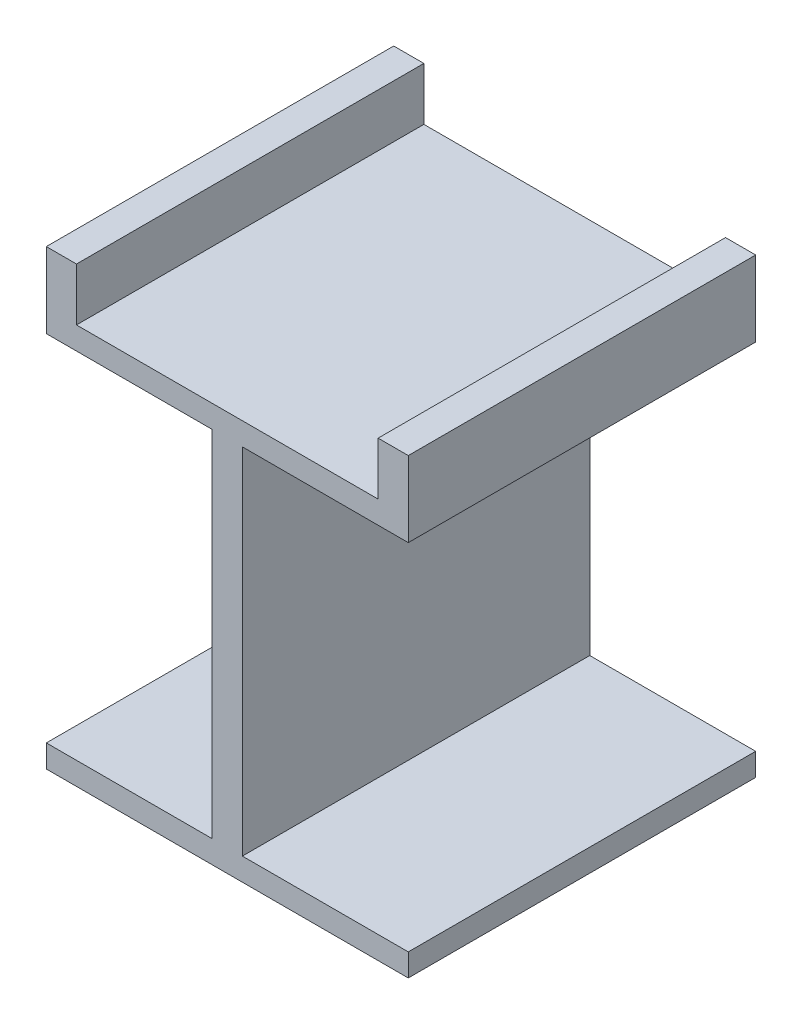
ISO-10303-21;
HEADER;
FILE_DESCRIPTION(('STEP AP214'),'2;1');
FILE_NAME('part.step','',(''),(''),'','','');
FILE_SCHEMA(('AUTOMOTIVE_DESIGN { 1 0 10303 214 1 1 1 1 }'));
ENDSEC;
DATA;
#1=APPLICATION_CONTEXT('core data for automotive mechanical design processes');
#2=APPLICATION_PROTOCOL_DEFINITION('international standard','automotive_design',2000,#1);
#3=PRODUCT_CONTEXT('',#1,'mechanical');
#4=PRODUCT('Part','Part','',(#3));
#5=PRODUCT_RELATED_PRODUCT_CATEGORY('part','',(#4));
#6=PRODUCT_DEFINITION_FORMATION('','',#4);
#7=PRODUCT_DEFINITION_CONTEXT('part definition',#1,'design');
#8=PRODUCT_DEFINITION('design','',#6,#7);
#9=PRODUCT_DEFINITION_SHAPE('','',#8);
#10=(LENGTH_UNIT() NAMED_UNIT(*) SI_UNIT(.MILLI.,.METRE.));
#11=(NAMED_UNIT(*) PLANE_ANGLE_UNIT() SI_UNIT($,.RADIAN.));
#12=(NAMED_UNIT(*) SI_UNIT($,.STERADIAN.) SOLID_ANGLE_UNIT());
#13=UNCERTAINTY_MEASURE_WITH_UNIT(LENGTH_MEASURE(1.E-05),#10,'distance_accuracy_value','');
#14=(GEOMETRIC_REPRESENTATION_CONTEXT(3) GLOBAL_UNCERTAINTY_ASSIGNED_CONTEXT((#13)) GLOBAL_UNIT_ASSIGNED_CONTEXT((#10,
#11,#12)) REPRESENTATION_CONTEXT('',''));
#15=CARTESIAN_POINT('',(0.,0.,0.));
#16=DIRECTION('',(0.,0.,1.));
#17=DIRECTION('',(1.,0.,0.));
#18=AXIS2_PLACEMENT_3D('',#15,#16,#17);
#19=CARTESIAN_POINT('',(0.,3.,0.));
#20=DIRECTION('',(0.,1.,0.));
#21=DIRECTION('',(0.,0.,1.));
#22=AXIS2_PLACEMENT_3D('',#19,#20,#21);
#23=PLANE('',#22);
#24=DIRECTION('',(0.,0.,-1.));
#25=VECTOR('',#24,1.);
#26=CARTESIAN_POINT('',(2.,3.,-23.035));
#27=LINE('',#26,#25);
#28=CARTESIAN_POINT('',(2.,3.,23.035));
#29=VERTEX_POINT('',#28);
#30=CARTESIAN_POINT('',(2.,3.,-23.035));
#31=VERTEX_POINT('',#30);
#32=EDGE_CURVE('E218',#29,#31,#27,.T.);
#33=ORIENTED_EDGE('',*,*,#32,.F.);
#34=DIRECTION('',(1.,0.,0.));
#35=VECTOR('',#34,1.);
#36=CARTESIAN_POINT('',(-24.,3.,23.035));
#37=LINE('',#36,#35);
#38=CARTESIAN_POINT('',(24.,3.,23.035));
#39=VERTEX_POINT('',#38);
#40=EDGE_CURVE('E246',#29,#39,#37,.T.);
#41=ORIENTED_EDGE('',*,*,#40,.T.);
#42=DIRECTION('',(0.,0.,-1.));
#43=VECTOR('',#42,1.);
#44=CARTESIAN_POINT('',(24.,3.,-23.035));
#45=LINE('',#44,#43);
#46=CARTESIAN_POINT('',(24.,3.,-23.035));
#47=VERTEX_POINT('',#46);
#48=EDGE_CURVE('E236',#39,#47,#45,.T.);
#49=ORIENTED_EDGE('',*,*,#48,.T.);
#50=DIRECTION('',(-1.,0.,0.));
#51=VECTOR('',#50,1.);
#52=CARTESIAN_POINT('',(-24.,3.,-23.035));
#53=LINE('',#52,#51);
#54=EDGE_CURVE('E241',#47,#31,#53,.T.);
#55=ORIENTED_EDGE('',*,*,#54,.T.);
#56=EDGE_LOOP('',(#33,#41,#49,#55));
#57=FACE_BOUND('',#56,.T.);
#58=ADVANCED_FACE('F32',(#57),#23,.T.);
#59=CARTESIAN_POINT('',(24.,3.,-23.035));
#60=DIRECTION('',(-1.,0.,0.));
#61=DIRECTION('',(0.,0.,1.));
#62=AXIS2_PLACEMENT_3D('',#59,#60,#61);
#63=PLANE('',#62);
#64=DIRECTION('',(0.,0.,-1.));
#65=VECTOR('',#64,1.);
#66=CARTESIAN_POINT('',(24.,0.,-23.035));
#67=LINE('',#66,#65);
#68=CARTESIAN_POINT('',(24.,0.,23.035));
#69=VERTEX_POINT('',#68);
#70=CARTESIAN_POINT('',(24.,0.,-23.035));
#71=VERTEX_POINT('',#70);
#72=EDGE_CURVE('E235',#69,#71,#67,.T.);
#73=ORIENTED_EDGE('',*,*,#72,.T.);
#74=DIRECTION('',(0.,-1.,0.));
#75=VECTOR('',#74,1.);
#76=CARTESIAN_POINT('',(24.,3.,-23.035));
#77=LINE('',#76,#75);
#78=EDGE_CURVE('E40',#47,#71,#77,.T.);
#79=ORIENTED_EDGE('',*,*,#78,.F.);
#80=ORIENTED_EDGE('',*,*,#48,.F.);
#81=DIRECTION('',(0.,-1.,0.));
#82=VECTOR('',#81,1.);
#83=CARTESIAN_POINT('',(24.,3.,23.035));
#84=LINE('',#83,#82);
#85=EDGE_CURVE('E250',#39,#69,#84,.T.);
#86=ORIENTED_EDGE('',*,*,#85,.T.);
#87=EDGE_LOOP('',(#73,#79,#80,#86));
#88=FACE_BOUND('',#87,.T.);
#89=ADVANCED_FACE('F34',(#88),#63,.F.);
#90=CARTESIAN_POINT('',(-24.,3.,-23.035));
#91=DIRECTION('',(0.,0.,1.));
#92=DIRECTION('',(1.,0.,0.));
#93=AXIS2_PLACEMENT_3D('',#90,#91,#92);
#94=PLANE('',#93);
#95=DIRECTION('',(0.,-1.,0.));
#96=VECTOR('',#95,1.);
#97=CARTESIAN_POINT('',(-2.,53.,-23.035));
#98=LINE('',#97,#96);
#99=CARTESIAN_POINT('',(-2.,50.,-23.035));
#100=VERTEX_POINT('',#99);
#101=CARTESIAN_POINT('',(-2.,3.,-23.035));
#102=VERTEX_POINT('',#101);
#103=EDGE_CURVE('E231',#100,#102,#98,.T.);
#104=ORIENTED_EDGE('',*,*,#103,.F.);
#105=DIRECTION('',(-1.,0.,0.));
#106=VECTOR('',#105,1.);
#107=CARTESIAN_POINT('',(-24.,50.,-23.035));
#108=LINE('',#107,#106);
#109=CARTESIAN_POINT('',(-24.,50.,-23.035));
#110=VERTEX_POINT('',#109);
#111=EDGE_CURVE('E207',#100,#110,#108,.T.);
#112=ORIENTED_EDGE('',*,*,#111,.T.);
#113=DIRECTION('',(0.,1.,0.));
#114=VECTOR('',#113,1.);
#115=CARTESIAN_POINT('',(-24.,50.,-23.035));
#116=LINE('',#115,#114);
#117=CARTESIAN_POINT('',(-24.,60.,-23.035));
#118=VERTEX_POINT('',#117);
#119=EDGE_CURVE('E157',#110,#118,#116,.T.);
#120=ORIENTED_EDGE('',*,*,#119,.T.);
#121=DIRECTION('',(1.,0.,0.));
#122=VECTOR('',#121,1.);
#123=CARTESIAN_POINT('',(-24.,60.,-23.035));
#124=LINE('',#123,#122);
#125=CARTESIAN_POINT('',(-20.,60.,-23.035));
#126=VERTEX_POINT('',#125);
#127=EDGE_CURVE('E166',#118,#126,#124,.T.);
#128=ORIENTED_EDGE('',*,*,#127,.T.);
#129=DIRECTION('',(0.,-1.,0.));
#130=VECTOR('',#129,1.);
#131=CARTESIAN_POINT('',(-20.,60.,-23.035));
#132=LINE('',#131,#130);
#133=CARTESIAN_POINT('',(-20.,53.,-23.035));
#134=VERTEX_POINT('',#133);
#135=EDGE_CURVE('E177',#126,#134,#132,.T.);
#136=ORIENTED_EDGE('',*,*,#135,.T.);
#137=DIRECTION('',(-1.,0.,0.));
#138=VECTOR('',#137,1.);
#139=CARTESIAN_POINT('',(-2.,53.,-23.035));
#140=LINE('',#139,#138);
#141=CARTESIAN_POINT('',(20.,53.,-23.035));
#142=VERTEX_POINT('',#141);
#143=EDGE_CURVE('E52',#142,#134,#140,.T.);
#144=ORIENTED_EDGE('',*,*,#143,.F.);
#145=DIRECTION('',(0.,-1.,0.));
#146=VECTOR('',#145,1.);
#147=CARTESIAN_POINT('',(20.,60.,-23.035));
#148=LINE('',#147,#146);
#149=CARTESIAN_POINT('',(20.,60.,-23.035));
#150=VERTEX_POINT('',#149);
#151=EDGE_CURVE('E197',#150,#142,#148,.T.);
#152=ORIENTED_EDGE('',*,*,#151,.F.);
#153=DIRECTION('',(-1.,0.,0.));
#154=VECTOR('',#153,1.);
#155=CARTESIAN_POINT('',(24.,60.,-23.035));
#156=LINE('',#155,#154);
#157=CARTESIAN_POINT('',(24.,60.,-23.035));
#158=VERTEX_POINT('',#157);
#159=EDGE_CURVE('E185',#158,#150,#156,.T.);
#160=ORIENTED_EDGE('',*,*,#159,.F.);
#161=DIRECTION('',(0.,1.,0.));
#162=VECTOR('',#161,1.);
#163=CARTESIAN_POINT('',(24.,50.,-23.035));
#164=LINE('',#163,#162);
#165=CARTESIAN_POINT('',(24.,50.,-23.035));
#166=VERTEX_POINT('',#165);
#167=EDGE_CURVE('E211',#166,#158,#164,.T.);
#168=ORIENTED_EDGE('',*,*,#167,.F.);
#169=CARTESIAN_POINT('',(2.,50.,-23.035));
#170=VERTEX_POINT('',#169);
#171=EDGE_CURVE('E208',#166,#170,#108,.T.);
#172=ORIENTED_EDGE('',*,*,#171,.T.);
#173=DIRECTION('',(0.,-1.,0.));
#174=VECTOR('',#173,1.);
#175=CARTESIAN_POINT('',(2.,53.,-23.035));
#176=LINE('',#175,#174);
#177=EDGE_CURVE('E233',#170,#31,#176,.T.);
#178=ORIENTED_EDGE('',*,*,#177,.T.);
#179=ORIENTED_EDGE('',*,*,#54,.F.);
#180=ORIENTED_EDGE('',*,*,#78,.T.);
#181=DIRECTION('',(-1.,0.,0.));
#182=VECTOR('',#181,1.);
#183=CARTESIAN_POINT('',(-24.,0.,-23.035));
#184=LINE('',#183,#182);
#185=CARTESIAN_POINT('',(-24.,0.,-23.035));
#186=VERTEX_POINT('',#185);
#187=EDGE_CURVE('E253',#71,#186,#184,.T.);
#188=ORIENTED_EDGE('',*,*,#187,.T.);
#189=DIRECTION('',(0.,-1.,0.));
#190=VECTOR('',#189,1.);
#191=CARTESIAN_POINT('',(-24.,3.,-23.035));
#192=LINE('',#191,#190);
#193=CARTESIAN_POINT('',(-24.,3.,-23.035));
#194=VERTEX_POINT('',#193);
#195=EDGE_CURVE('E263',#194,#186,#192,.T.);
#196=ORIENTED_EDGE('',*,*,#195,.F.);
#197=EDGE_CURVE('E239',#102,#194,#53,.T.);
#198=ORIENTED_EDGE('',*,*,#197,.F.);
#199=EDGE_LOOP('',(#104,#112,#120,#128,#136,#144,#152,#160,#168,#172,#178,#179,#180,#188,#196,#198));
#200=FACE_BOUND('',#199,.T.);
#201=ADVANCED_FACE('F269',(#200),#94,.F.);
#202=CARTESIAN_POINT('',(-24.,3.,-23.035));
#203=DIRECTION('',(1.,0.,0.));
#204=DIRECTION('',(0.,0.,-1.));
#205=AXIS2_PLACEMENT_3D('',#202,#203,#204);
#206=PLANE('',#205);
#207=DIRECTION('',(0.,0.,1.));
#208=VECTOR('',#207,1.);
#209=CARTESIAN_POINT('',(-24.,0.,-23.035));
#210=LINE('',#209,#208);
#211=CARTESIAN_POINT('',(-24.,0.,23.035));
#212=VERTEX_POINT('',#211);
#213=EDGE_CURVE('E255',#186,#212,#210,.T.);
#214=ORIENTED_EDGE('',*,*,#213,.T.);
#215=DIRECTION('',(0.,-1.,0.));
#216=VECTOR('',#215,1.);
#217=CARTESIAN_POINT('',(-24.,3.,23.035));
#218=LINE('',#217,#216);
#219=CARTESIAN_POINT('',(-24.,3.,23.035));
#220=VERTEX_POINT('',#219);
#221=EDGE_CURVE('E260',#220,#212,#218,.T.);
#222=ORIENTED_EDGE('',*,*,#221,.F.);
#223=DIRECTION('',(0.,0.,1.));
#224=VECTOR('',#223,1.);
#225=CARTESIAN_POINT('',(-24.,3.,-23.035));
#226=LINE('',#225,#224);
#227=EDGE_CURVE('E244',#194,#220,#226,.T.);
#228=ORIENTED_EDGE('',*,*,#227,.F.);
#229=ORIENTED_EDGE('',*,*,#195,.T.);
#230=EDGE_LOOP('',(#214,#222,#228,#229));
#231=FACE_BOUND('',#230,.T.);
#232=ADVANCED_FACE('F281',(#231),#206,.F.);
#233=CARTESIAN_POINT('',(-24.,3.,23.035));
#234=DIRECTION('',(0.,0.,-1.));
#235=DIRECTION('',(-1.,0.,0.));
#236=AXIS2_PLACEMENT_3D('',#233,#234,#235);
#237=PLANE('',#236);
#238=DIRECTION('',(0.,-1.,0.));
#239=VECTOR('',#238,1.);
#240=CARTESIAN_POINT('',(2.,53.,23.035));
#241=LINE('',#240,#239);
#242=CARTESIAN_POINT('',(2.,50.,23.035));
#243=VERTEX_POINT('',#242);
#244=EDGE_CURVE('E223',#243,#29,#241,.T.);
#245=ORIENTED_EDGE('',*,*,#244,.F.);
#246=DIRECTION('',(1.,0.,0.));
#247=VECTOR('',#246,1.);
#248=CARTESIAN_POINT('',(-24.,50.,23.035));
#249=LINE('',#248,#247);
#250=CARTESIAN_POINT('',(24.,50.,23.035));
#251=VERTEX_POINT('',#250);
#252=EDGE_CURVE('E203',#243,#251,#249,.T.);
#253=ORIENTED_EDGE('',*,*,#252,.T.);
#254=DIRECTION('',(0.,1.,0.));
#255=VECTOR('',#254,1.);
#256=CARTESIAN_POINT('',(24.,50.,23.035));
#257=LINE('',#256,#255);
#258=CARTESIAN_POINT('',(24.,60.,23.035));
#259=VERTEX_POINT('',#258);
#260=EDGE_CURVE('E156',#251,#259,#257,.T.);
#261=ORIENTED_EDGE('',*,*,#260,.T.);
#262=DIRECTION('',(1.,0.,0.));
#263=VECTOR('',#262,1.);
#264=CARTESIAN_POINT('',(24.,60.,23.035));
#265=LINE('',#264,#263);
#266=CARTESIAN_POINT('',(20.,60.,23.035));
#267=VERTEX_POINT('',#266);
#268=EDGE_CURVE('E189',#267,#259,#265,.T.);
#269=ORIENTED_EDGE('',*,*,#268,.F.);
#270=DIRECTION('',(0.,-1.,0.));
#271=VECTOR('',#270,1.);
#272=CARTESIAN_POINT('',(20.,60.,23.035));
#273=LINE('',#272,#271);
#274=CARTESIAN_POINT('',(20.,53.,23.035));
#275=VERTEX_POINT('',#274);
#276=EDGE_CURVE('E192',#267,#275,#273,.T.);
#277=ORIENTED_EDGE('',*,*,#276,.T.);
#278=DIRECTION('',(1.,0.,0.));
#279=VECTOR('',#278,1.);
#280=CARTESIAN_POINT('',(-2.,53.,23.035));
#281=LINE('',#280,#279);
#282=CARTESIAN_POINT('',(-20.,53.,23.035));
#283=VERTEX_POINT('',#282);
#284=EDGE_CURVE('E220',#283,#275,#281,.T.);
#285=ORIENTED_EDGE('',*,*,#284,.F.);
#286=DIRECTION('',(0.,-1.,0.));
#287=VECTOR('',#286,1.);
#288=CARTESIAN_POINT('',(-20.,60.,23.035));
#289=LINE('',#288,#287);
#290=CARTESIAN_POINT('',(-20.,60.,23.035));
#291=VERTEX_POINT('',#290);
#292=EDGE_CURVE('E171',#291,#283,#289,.T.);
#293=ORIENTED_EDGE('',*,*,#292,.F.);
#294=DIRECTION('',(-1.,0.,0.));
#295=VECTOR('',#294,1.);
#296=CARTESIAN_POINT('',(-24.,60.,23.035));
#297=LINE('',#296,#295);
#298=CARTESIAN_POINT('',(-24.,60.,23.035));
#299=VERTEX_POINT('',#298);
#300=EDGE_CURVE('E163',#291,#299,#297,.T.);
#301=ORIENTED_EDGE('',*,*,#300,.T.);
#302=DIRECTION('',(0.,1.,0.));
#303=VECTOR('',#302,1.);
#304=CARTESIAN_POINT('',(-24.,50.,23.035));
#305=LINE('',#304,#303);
#306=CARTESIAN_POINT('',(-24.,50.,23.035));
#307=VERTEX_POINT('',#306);
#308=EDGE_CURVE('E144',#307,#299,#305,.T.);
#309=ORIENTED_EDGE('',*,*,#308,.F.);
#310=CARTESIAN_POINT('',(-2.,50.,23.035));
#311=VERTEX_POINT('',#310);
#312=EDGE_CURVE('E204',#307,#311,#249,.T.);
#313=ORIENTED_EDGE('',*,*,#312,.T.);
#314=DIRECTION('',(0.,-1.,0.));
#315=VECTOR('',#314,1.);
#316=CARTESIAN_POINT('',(-2.,53.,23.035));
#317=LINE('',#316,#315);
#318=CARTESIAN_POINT('',(-2.,3.,23.035));
#319=VERTEX_POINT('',#318);
#320=EDGE_CURVE('E229',#311,#319,#317,.T.);
#321=ORIENTED_EDGE('',*,*,#320,.T.);
#322=EDGE_CURVE('E247',#220,#319,#37,.T.);
#323=ORIENTED_EDGE('',*,*,#322,.F.);
#324=ORIENTED_EDGE('',*,*,#221,.T.);
#325=DIRECTION('',(1.,0.,0.));
#326=VECTOR('',#325,1.);
#327=CARTESIAN_POINT('',(-24.,0.,23.035));
#328=LINE('',#327,#326);
#329=EDGE_CURVE('E240',#212,#69,#328,.T.);
#330=ORIENTED_EDGE('',*,*,#329,.T.);
#331=ORIENTED_EDGE('',*,*,#85,.F.);
#332=ORIENTED_EDGE('',*,*,#40,.F.);
#333=EDGE_LOOP('',(#245,#253,#261,#269,#277,#285,#293,#301,#309,#313,#321,#323,#324,#330,#331,#332));
#334=FACE_BOUND('',#333,.T.);
#335=ADVANCED_FACE('F169',(#334),#237,.F.);
#336=DIRECTION('',(0.,0.,1.));
#337=VECTOR('',#336,1.);
#338=CARTESIAN_POINT('',(-2.,3.,-23.035));
#339=LINE('',#338,#337);
#340=EDGE_CURVE('E221',#102,#319,#339,.T.);
#341=ORIENTED_EDGE('',*,*,#340,.F.);
#342=ORIENTED_EDGE('',*,*,#197,.T.);
#343=ORIENTED_EDGE('',*,*,#227,.T.);
#344=ORIENTED_EDGE('',*,*,#322,.T.);
#345=EDGE_LOOP('',(#341,#342,#343,#344));
#346=FACE_BOUND('',#345,.T.);
#347=ADVANCED_FACE('F287',(#346),#23,.T.);
#348=CARTESIAN_POINT('',(0.,0.,0.));
#349=DIRECTION('',(0.,1.,0.));
#350=DIRECTION('',(0.,0.,1.));
#351=AXIS2_PLACEMENT_3D('',#348,#349,#350);
#352=PLANE('',#351);
#353=ORIENTED_EDGE('',*,*,#72,.F.);
#354=ORIENTED_EDGE('',*,*,#329,.F.);
#355=ORIENTED_EDGE('',*,*,#213,.F.);
#356=ORIENTED_EDGE('',*,*,#187,.F.);
#357=EDGE_LOOP('',(#353,#354,#355,#356));
#358=FACE_BOUND('',#357,.T.);
#359=ADVANCED_FACE('F277',(#358),#352,.F.);
#360=CARTESIAN_POINT('',(2.,53.,-23.035));
#361=DIRECTION('',(-1.,0.,0.));
#362=DIRECTION('',(0.,0.,1.));
#363=AXIS2_PLACEMENT_3D('',#360,#361,#362);
#364=PLANE('',#363);
#365=ORIENTED_EDGE('',*,*,#177,.F.);
#366=DIRECTION('',(0.,0.,1.));
#367=VECTOR('',#366,1.);
#368=CARTESIAN_POINT('',(2.,50.,-23.035));
#369=LINE('',#368,#367);
#370=EDGE_CURVE('E215',#170,#243,#369,.T.);
#371=ORIENTED_EDGE('',*,*,#370,.T.);
#372=ORIENTED_EDGE('',*,*,#244,.T.);
#373=ORIENTED_EDGE('',*,*,#32,.T.);
#374=EDGE_LOOP('',(#365,#371,#372,#373));
#375=FACE_BOUND('',#374,.T.);
#376=ADVANCED_FACE('F319',(#375),#364,.F.);
#377=CARTESIAN_POINT('',(-2.,53.,-23.035));
#378=DIRECTION('',(1.,0.,0.));
#379=DIRECTION('',(0.,0.,-1.));
#380=AXIS2_PLACEMENT_3D('',#377,#378,#379);
#381=PLANE('',#380);
#382=ORIENTED_EDGE('',*,*,#320,.F.);
#383=DIRECTION('',(0.,0.,-1.));
#384=VECTOR('',#383,1.);
#385=CARTESIAN_POINT('',(-2.,50.,-23.035));
#386=LINE('',#385,#384);
#387=EDGE_CURVE('E11',#311,#100,#386,.T.);
#388=ORIENTED_EDGE('',*,*,#387,.T.);
#389=ORIENTED_EDGE('',*,*,#103,.T.);
#390=ORIENTED_EDGE('',*,*,#340,.T.);
#391=EDGE_LOOP('',(#382,#388,#389,#390));
#392=FACE_BOUND('',#391,.T.);
#393=ADVANCED_FACE('F290',(#392),#381,.F.);
#394=CARTESIAN_POINT('',(0.,53.,0.));
#395=DIRECTION('',(0.,1.,0.));
#396=DIRECTION('',(0.,0.,1.));
#397=AXIS2_PLACEMENT_3D('',#394,#395,#396);
#398=PLANE('',#397);
#399=DIRECTION('',(0.,0.,1.));
#400=VECTOR('',#399,1.);
#401=CARTESIAN_POINT('',(-20.,53.,-23.035));
#402=LINE('',#401,#400);
#403=EDGE_CURVE('E47',#134,#283,#402,.T.);
#404=ORIENTED_EDGE('',*,*,#403,.T.);
#405=ORIENTED_EDGE('',*,*,#284,.T.);
#406=DIRECTION('',(0.,0.,1.));
#407=VECTOR('',#406,1.);
#408=CARTESIAN_POINT('',(20.,53.,-23.035));
#409=LINE('',#408,#407);
#410=EDGE_CURVE('E181',#142,#275,#409,.T.);
#411=ORIENTED_EDGE('',*,*,#410,.F.);
#412=ORIENTED_EDGE('',*,*,#143,.T.);
#413=EDGE_LOOP('',(#404,#405,#411,#412));
#414=FACE_BOUND('',#413,.T.);
#415=ADVANCED_FACE('F302',(#414),#398,.T.);
#416=CARTESIAN_POINT('',(-24.,50.,-23.035));
#417=DIRECTION('',(-1.,0.,0.));
#418=DIRECTION('',(0.,0.,1.));
#419=AXIS2_PLACEMENT_3D('',#416,#417,#418);
#420=PLANE('',#419);
#421=ORIENTED_EDGE('',*,*,#308,.T.);
#422=DIRECTION('',(0.,0.,-1.));
#423=VECTOR('',#422,1.);
#424=CARTESIAN_POINT('',(-24.,60.,-23.035));
#425=LINE('',#424,#423);
#426=EDGE_CURVE('E148',#299,#118,#425,.T.);
#427=ORIENTED_EDGE('',*,*,#426,.T.);
#428=ORIENTED_EDGE('',*,*,#119,.F.);
#429=DIRECTION('',(0.,0.,1.));
#430=VECTOR('',#429,1.);
#431=CARTESIAN_POINT('',(-24.,50.,-23.035));
#432=LINE('',#431,#430);
#433=EDGE_CURVE('E151',#110,#307,#432,.T.);
#434=ORIENTED_EDGE('',*,*,#433,.T.);
#435=EDGE_LOOP('',(#421,#427,#428,#434));
#436=FACE_BOUND('',#435,.T.);
#437=ADVANCED_FACE('F146',(#436),#420,.T.);
#438=CARTESIAN_POINT('',(0.,50.,0.));
#439=DIRECTION('',(0.,-1.,0.));
#440=DIRECTION('',(0.,0.,1.));
#441=AXIS2_PLACEMENT_3D('',#438,#439,#440);
#442=PLANE('',#441);
#443=ORIENTED_EDGE('',*,*,#387,.F.);
#444=ORIENTED_EDGE('',*,*,#312,.F.);
#445=ORIENTED_EDGE('',*,*,#433,.F.);
#446=ORIENTED_EDGE('',*,*,#111,.F.);
#447=EDGE_LOOP('',(#443,#444,#445,#446));
#448=FACE_BOUND('',#447,.T.);
#449=ADVANCED_FACE('F292',(#448),#442,.T.);
#450=ORIENTED_EDGE('',*,*,#370,.F.);
#451=ORIENTED_EDGE('',*,*,#171,.F.);
#452=DIRECTION('',(0.,0.,-1.));
#453=VECTOR('',#452,1.);
#454=CARTESIAN_POINT('',(24.,50.,-23.035));
#455=LINE('',#454,#453);
#456=EDGE_CURVE('E200',#251,#166,#455,.T.);
#457=ORIENTED_EDGE('',*,*,#456,.F.);
#458=ORIENTED_EDGE('',*,*,#252,.F.);
#459=EDGE_LOOP('',(#450,#451,#457,#458));
#460=FACE_BOUND('',#459,.T.);
#461=ADVANCED_FACE('F294',(#460),#442,.T.);
#462=CARTESIAN_POINT('',(24.,50.,-23.035));
#463=DIRECTION('',(1.,0.,0.));
#464=DIRECTION('',(0.,0.,-1.));
#465=AXIS2_PLACEMENT_3D('',#462,#463,#464);
#466=PLANE('',#465);
#467=ORIENTED_EDGE('',*,*,#167,.T.);
#468=DIRECTION('',(0.,0.,-1.));
#469=VECTOR('',#468,1.);
#470=CARTESIAN_POINT('',(24.,60.,-23.035));
#471=LINE('',#470,#469);
#472=EDGE_CURVE('E182',#259,#158,#471,.T.);
#473=ORIENTED_EDGE('',*,*,#472,.F.);
#474=ORIENTED_EDGE('',*,*,#260,.F.);
#475=ORIENTED_EDGE('',*,*,#456,.T.);
#476=EDGE_LOOP('',(#467,#473,#474,#475));
#477=FACE_BOUND('',#476,.T.);
#478=ADVANCED_FACE('F300',(#477),#466,.T.);
#479=CARTESIAN_POINT('',(20.,60.,-23.035));
#480=DIRECTION('',(1.,0.,0.));
#481=DIRECTION('',(0.,0.,-1.));
#482=AXIS2_PLACEMENT_3D('',#479,#480,#481);
#483=PLANE('',#482);
#484=ORIENTED_EDGE('',*,*,#410,.T.);
#485=ORIENTED_EDGE('',*,*,#276,.F.);
#486=DIRECTION('',(0.,0.,1.));
#487=VECTOR('',#486,1.);
#488=CARTESIAN_POINT('',(20.,60.,-23.035));
#489=LINE('',#488,#487);
#490=EDGE_CURVE('E187',#150,#267,#489,.T.);
#491=ORIENTED_EDGE('',*,*,#490,.F.);
#492=ORIENTED_EDGE('',*,*,#151,.T.);
#493=EDGE_LOOP('',(#484,#485,#491,#492));
#494=FACE_BOUND('',#493,.T.);
#495=ADVANCED_FACE('F394',(#494),#483,.F.);
#496=CARTESIAN_POINT('',(0.,60.,0.));
#497=DIRECTION('',(0.,-1.,0.));
#498=DIRECTION('',(0.,0.,-1.));
#499=AXIS2_PLACEMENT_3D('',#496,#497,#498);
#500=PLANE('',#499);
#501=ORIENTED_EDGE('',*,*,#472,.T.);
#502=ORIENTED_EDGE('',*,*,#159,.T.);
#503=ORIENTED_EDGE('',*,*,#490,.T.);
#504=ORIENTED_EDGE('',*,*,#268,.T.);
#505=EDGE_LOOP('',(#501,#502,#503,#504));
#506=FACE_BOUND('',#505,.T.);
#507=ADVANCED_FACE('F404',(#506),#500,.F.);
#508=CARTESIAN_POINT('',(-20.,60.,-23.035));
#509=DIRECTION('',(1.,0.,0.));
#510=DIRECTION('',(0.,0.,-1.));
#511=AXIS2_PLACEMENT_3D('',#508,#509,#510);
#512=PLANE('',#511);
#513=ORIENTED_EDGE('',*,*,#403,.F.);
#514=ORIENTED_EDGE('',*,*,#135,.F.);
#515=DIRECTION('',(0.,0.,1.));
#516=VECTOR('',#515,1.);
#517=CARTESIAN_POINT('',(-20.,60.,-23.035));
#518=LINE('',#517,#516);
#519=EDGE_CURVE('E172',#126,#291,#518,.T.);
#520=ORIENTED_EDGE('',*,*,#519,.T.);
#521=ORIENTED_EDGE('',*,*,#292,.T.);
#522=EDGE_LOOP('',(#513,#514,#520,#521));
#523=FACE_BOUND('',#522,.T.);
#524=ADVANCED_FACE('F412',(#523),#512,.T.);
#525=CARTESIAN_POINT('',(0.,60.,0.));
#526=DIRECTION('',(0.,-1.,0.));
#527=DIRECTION('',(0.,0.,-1.));
#528=AXIS2_PLACEMENT_3D('',#525,#526,#527);
#529=PLANE('',#528);
#530=ORIENTED_EDGE('',*,*,#426,.F.);
#531=ORIENTED_EDGE('',*,*,#300,.F.);
#532=ORIENTED_EDGE('',*,*,#519,.F.);
#533=ORIENTED_EDGE('',*,*,#127,.F.);
#534=EDGE_LOOP('',(#530,#531,#532,#533));
#535=FACE_BOUND('',#534,.T.);
#536=ADVANCED_FACE('F161',(#535),#529,.F.);
#537=CLOSED_SHELL('',(#58,#89,#201,#232,#335,#347,#359,#376,#393,#415,#437,#449,#461,#478,#495,
#507,#524,#536));
#538=MANIFOLD_SOLID_BREP('B2',#537);
#539=ADVANCED_BREP_SHAPE_REPRESENTATION('',(#18,#538),#14);
#540=SHAPE_DEFINITION_REPRESENTATION(#9,#539);
ENDSEC;
END-ISO-10303-21;
